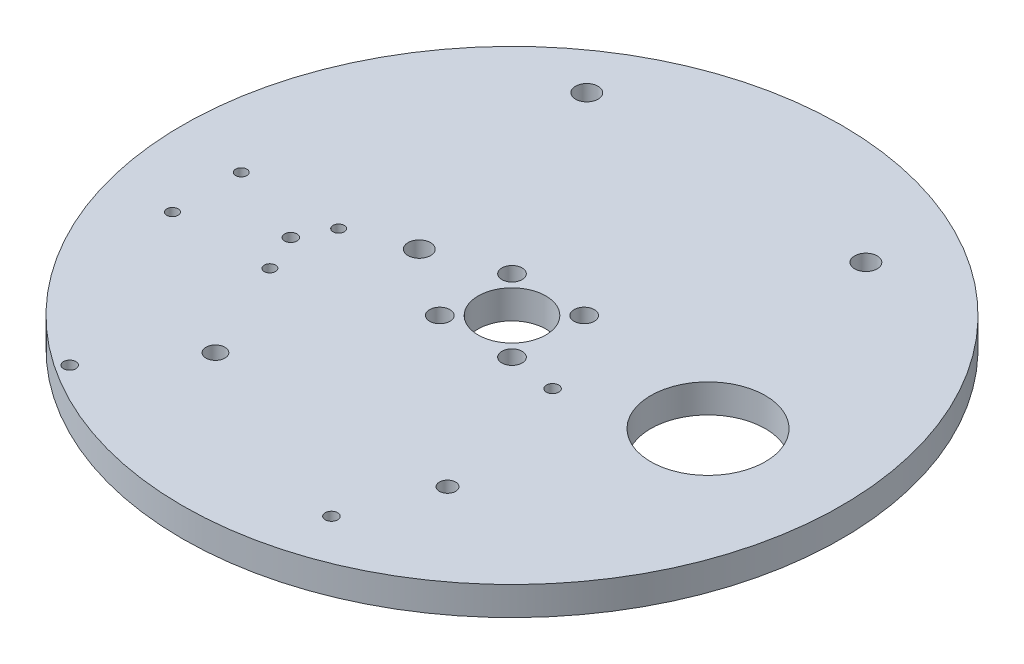
ISO-10303-21;
HEADER;
FILE_DESCRIPTION(('STEP AP214'),'2;1');
FILE_NAME('part.step','',(''),(''),'','','');
FILE_SCHEMA(('AUTOMOTIVE_DESIGN { 1 0 10303 214 1 1 1 1 }'));
ENDSEC;
DATA;
#1=APPLICATION_CONTEXT('core data for automotive mechanical design processes');
#2=APPLICATION_PROTOCOL_DEFINITION('international standard','automotive_design',2000,#1);
#3=PRODUCT_CONTEXT('',#1,'mechanical');
#4=PRODUCT('Part','Part','',(#3));
#5=PRODUCT_RELATED_PRODUCT_CATEGORY('part','',(#4));
#6=PRODUCT_DEFINITION_FORMATION('','',#4);
#7=PRODUCT_DEFINITION_CONTEXT('part definition',#1,'design');
#8=PRODUCT_DEFINITION('design','',#6,#7);
#9=PRODUCT_DEFINITION_SHAPE('','',#8);
#10=(LENGTH_UNIT() NAMED_UNIT(*) SI_UNIT(.MILLI.,.METRE.));
#11=(NAMED_UNIT(*) PLANE_ANGLE_UNIT() SI_UNIT($,.RADIAN.));
#12=(NAMED_UNIT(*) SI_UNIT($,.STERADIAN.) SOLID_ANGLE_UNIT());
#13=UNCERTAINTY_MEASURE_WITH_UNIT(LENGTH_MEASURE(1.E-05),#10,'distance_accuracy_value','');
#14=(GEOMETRIC_REPRESENTATION_CONTEXT(3) GLOBAL_UNCERTAINTY_ASSIGNED_CONTEXT((#13)) GLOBAL_UNIT_ASSIGNED_CONTEXT((#10,
#11,#12)) REPRESENTATION_CONTEXT('',''));
#15=CARTESIAN_POINT('',(0.,0.,0.));
#16=DIRECTION('',(0.,0.,1.));
#17=DIRECTION('',(1.,0.,0.));
#18=AXIS2_PLACEMENT_3D('',#15,#16,#17);
#19=CARTESIAN_POINT('',(0.,6.35,0.));
#20=DIRECTION('',(0.,1.,0.));
#21=DIRECTION('',(0.,0.,1.));
#22=AXIS2_PLACEMENT_3D('',#19,#20,#21);
#23=PLANE('',#22);
#24=CARTESIAN_POINT('',(-34.460546586566,6.35,-51.0306752149271));
#25=DIRECTION('',(0.,1.,0.));
#26=DIRECTION('',(0.,0.,1.));
#27=AXIS2_PLACEMENT_3D('',#24,#25,#26);
#28=CIRCLE('',#27,2.5);
#29=CARTESIAN_POINT('',(-34.460546586566,6.35,-48.5306752149271));
#30=VERTEX_POINT('',#29);
#31=EDGE_CURVE('E156',#30,#30,#28,.T.);
#32=ORIENTED_EDGE('',*,*,#31,.F.);
#33=EDGE_LOOP('',(#32));
#34=FACE_BOUND('',#33,.T.);
#35=CARTESIAN_POINT('',(29.0185044188483,6.35,-49.3996989882434));
#36=DIRECTION('',(0.,1.,0.));
#37=DIRECTION('',(0.,0.,1.));
#38=AXIS2_PLACEMENT_3D('',#35,#36,#37);
#39=CIRCLE('',#38,2.5);
#40=CARTESIAN_POINT('',(29.0185044188483,6.35,-46.8996989882434));
#41=VERTEX_POINT('',#40);
#42=EDGE_CURVE('E150',#41,#41,#39,.T.);
#43=ORIENTED_EDGE('',*,*,#42,.F.);
#44=EDGE_LOOP('',(#43));
#45=FACE_BOUND('',#44,.T.);
#46=CARTESIAN_POINT('',(-23.0042783177628,6.35,-2.46040120547545));
#47=DIRECTION('',(0.,1.,0.));
#48=DIRECTION('',(0.,0.,1.));
#49=AXIS2_PLACEMENT_3D('',#46,#47,#48);
#50=CIRCLE('',#49,2.5);
#51=CARTESIAN_POINT('',(-23.0042783177628,6.35,0.0395987945245486));
#52=VERTEX_POINT('',#51);
#53=EDGE_CURVE('E144',#52,#52,#50,.T.);
#54=ORIENTED_EDGE('',*,*,#53,.F.);
#55=EDGE_LOOP('',(#54));
#56=FACE_BOUND('',#55,.T.);
#57=CARTESIAN_POINT('',(18.529637443115,6.35,9.53980639289024));
#58=DIRECTION('',(0.,-1.,0.));
#59=DIRECTION('',(0.,0.,-1.));
#60=AXIS2_PLACEMENT_3D('',#57,#58,#59);
#61=CIRCLE('',#60,1.375);
#62=CARTESIAN_POINT('',(18.529637443115,6.35,8.16480639289024));
#63=VERTEX_POINT('',#62);
#64=EDGE_CURVE('E114',#63,#63,#61,.T.);
#65=ORIENTED_EDGE('',*,*,#64,.T.);
#66=EDGE_LOOP('',(#65));
#67=FACE_BOUND('',#66,.T.);
#68=CARTESIAN_POINT('',(25.7171869119312,6.35,40.));
#69=DIRECTION('',(0.,-1.,0.));
#70=DIRECTION('',(0.,0.,-1.));
#71=AXIS2_PLACEMENT_3D('',#68,#69,#70);
#72=CIRCLE('',#71,1.8);
#73=CARTESIAN_POINT('',(25.7171869119312,6.35,38.2));
#74=VERTEX_POINT('',#73);
#75=EDGE_CURVE('E121',#74,#74,#72,.T.);
#76=ORIENTED_EDGE('',*,*,#75,.T.);
#77=EDGE_LOOP('',(#76));
#78=FACE_BOUND('',#77,.T.);
#79=CARTESIAN_POINT('',(18.529637443115,6.35,58.5398063928902));
#80=DIRECTION('',(0.,-1.,0.));
#81=DIRECTION('',(0.,0.,-1.));
#82=AXIS2_PLACEMENT_3D('',#79,#80,#81);
#83=CIRCLE('',#82,1.375);
#84=CARTESIAN_POINT('',(18.529637443115,6.35,57.1648063928902));
#85=VERTEX_POINT('',#84);
#86=EDGE_CURVE('E127',#85,#85,#83,.T.);
#87=ORIENTED_EDGE('',*,*,#86,.T.);
#88=EDGE_LOOP('',(#87));
#89=FACE_BOUND('',#88,.T.);
#90=CARTESIAN_POINT('',(-39.470362556885,6.35,58.5398063928902));
#91=DIRECTION('',(0.,-1.,0.));
#92=DIRECTION('',(0.,0.,-1.));
#93=AXIS2_PLACEMENT_3D('',#90,#91,#92);
#94=CIRCLE('',#93,1.375);
#95=CARTESIAN_POINT('',(-39.470362556885,6.35,57.1648063928902));
#96=VERTEX_POINT('',#95);
#97=EDGE_CURVE('E133',#96,#96,#94,.T.);
#98=ORIENTED_EDGE('',*,*,#97,.T.);
#99=EDGE_LOOP('',(#98));
#100=FACE_BOUND('',#99,.T.);
#101=CARTESIAN_POINT('',(-57.46,6.35,2.54));
#102=DIRECTION('',(0.,-1.,0.));
#103=DIRECTION('',(0.,0.,-1.));
#104=AXIS2_PLACEMENT_3D('',#101,#102,#103);
#105=CIRCLE('',#104,1.25);
#106=CARTESIAN_POINT('',(-57.46,6.35,1.29));
#107=VERTEX_POINT('',#106);
#108=EDGE_CURVE('E90',#107,#107,#105,.T.);
#109=ORIENTED_EDGE('',*,*,#108,.T.);
#110=EDGE_LOOP('',(#109));
#111=FACE_BOUND('',#110,.T.);
#112=CARTESIAN_POINT('',(-35.87,6.35,2.54));
#113=DIRECTION('',(0.,-1.,0.));
#114=DIRECTION('',(0.,0.,-1.));
#115=AXIS2_PLACEMENT_3D('',#112,#113,#114);
#116=CIRCLE('',#115,1.25);
#117=CARTESIAN_POINT('',(-35.87,6.35,1.29));
#118=VERTEX_POINT('',#117);
#119=EDGE_CURVE('E97',#118,#118,#116,.T.);
#120=ORIENTED_EDGE('',*,*,#119,.T.);
#121=EDGE_LOOP('',(#120));
#122=FACE_BOUND('',#121,.T.);
#123=CARTESIAN_POINT('',(-39.470362556885,6.35,9.53980639289024));
#124=DIRECTION('',(0.,-1.,0.));
#125=DIRECTION('',(0.,0.,-1.));
#126=AXIS2_PLACEMENT_3D('',#123,#124,#125);
#127=CIRCLE('',#126,1.375);
#128=CARTESIAN_POINT('',(-39.470362556885,6.35,8.16480639289024));
#129=VERTEX_POINT('',#128);
#130=EDGE_CURVE('E103',#129,#129,#127,.T.);
#131=ORIENTED_EDGE('',*,*,#130,.T.);
#132=EDGE_LOOP('',(#131));
#133=FACE_BOUND('',#132,.T.);
#134=CARTESIAN_POINT('',(-57.46,6.35,17.78));
#135=DIRECTION('',(0.,-1.,0.));
#136=DIRECTION('',(0.,0.,-1.));
#137=AXIS2_PLACEMENT_3D('',#134,#135,#136);
#138=CIRCLE('',#137,1.25);
#139=CARTESIAN_POINT('',(-57.46,6.35,16.53));
#140=VERTEX_POINT('',#139);
#141=EDGE_CURVE('E109',#140,#140,#138,.T.);
#142=ORIENTED_EDGE('',*,*,#141,.T.);
#143=EDGE_LOOP('',(#142));
#144=FACE_BOUND('',#143,.T.);
#145=CARTESIAN_POINT('',(-35.87,6.35,17.78));
#146=DIRECTION('',(0.,-1.,0.));
#147=DIRECTION('',(0.,0.,-1.));
#148=AXIS2_PLACEMENT_3D('',#145,#146,#147);
#149=CIRCLE('',#148,1.25);
#150=CARTESIAN_POINT('',(-35.87,6.35,16.53));
#151=VERTEX_POINT('',#150);
#152=EDGE_CURVE('E138',#151,#151,#149,.T.);
#153=ORIENTED_EDGE('',*,*,#152,.T.);
#154=EDGE_LOOP('',(#153));
#155=FACE_BOUND('',#154,.T.);
#156=CARTESIAN_POINT('',(-25.7171869119312,6.35,40.));
#157=DIRECTION('',(0.,-1.,0.));
#158=DIRECTION('',(0.,0.,-1.));
#159=AXIS2_PLACEMENT_3D('',#156,#157,#158);
#160=CIRCLE('',#159,2.1);
#161=CARTESIAN_POINT('',(-25.7171869119312,6.35,37.9));
#162=VERTEX_POINT('',#161);
#163=EDGE_CURVE('E81',#162,#162,#160,.T.);
#164=ORIENTED_EDGE('',*,*,#163,.T.);
#165=EDGE_LOOP('',(#164));
#166=FACE_BOUND('',#165,.T.);
#167=CARTESIAN_POINT('',(43.4341818398759,6.35,0.));
#168=DIRECTION('',(0.,-1.,0.));
#169=DIRECTION('',(0.,0.,-1.));
#170=AXIS2_PLACEMENT_3D('',#167,#168,#169);
#171=CIRCLE('',#170,12.7);
#172=CARTESIAN_POINT('',(43.4341818398759,6.35,-12.7));
#173=VERTEX_POINT('',#172);
#174=EDGE_CURVE('E64',#173,#173,#171,.T.);
#175=ORIENTED_EDGE('',*,*,#174,.T.);
#176=EDGE_LOOP('',(#175));
#177=FACE_BOUND('',#176,.T.);
#178=CARTESIAN_POINT('',(8.,6.35,-8.));
#179=DIRECTION('',(0.,1.,0.));
#180=DIRECTION('',(0.,0.,1.));
#181=AXIS2_PLACEMENT_3D('',#178,#179,#180);
#182=CIRCLE('',#181,2.25);
#183=CARTESIAN_POINT('',(8.,6.35,-5.75));
#184=VERTEX_POINT('',#183);
#185=EDGE_CURVE('E57',#184,#184,#182,.F.);
#186=ORIENTED_EDGE('',*,*,#185,.T.);
#187=EDGE_LOOP('',(#186));
#188=FACE_BOUND('',#187,.T.);
#189=CARTESIAN_POINT('',(-8.,6.35,-8.));
#190=DIRECTION('',(0.,1.,0.));
#191=DIRECTION('',(0.,0.,1.));
#192=AXIS2_PLACEMENT_3D('',#189,#190,#191);
#193=CIRCLE('',#192,2.25);
#194=CARTESIAN_POINT('',(-8.,6.35,-5.75));
#195=VERTEX_POINT('',#194);
#196=EDGE_CURVE('E54',#195,#195,#193,.T.);
#197=ORIENTED_EDGE('',*,*,#196,.F.);
#198=EDGE_LOOP('',(#197));
#199=FACE_BOUND('',#198,.T.);
#200=CARTESIAN_POINT('',(0.,6.35,0.));
#201=DIRECTION('',(0.,1.,0.));
#202=DIRECTION('',(0.,0.,1.));
#203=AXIS2_PLACEMENT_3D('',#200,#201,#202);
#204=CIRCLE('',#203,7.5);
#205=CARTESIAN_POINT('',(0.,6.35,7.5));
#206=VERTEX_POINT('',#205);
#207=EDGE_CURVE('E48',#206,#206,#204,.T.);
#208=ORIENTED_EDGE('',*,*,#207,.F.);
#209=EDGE_LOOP('',(#208));
#210=FACE_BOUND('',#209,.T.);
#211=CARTESIAN_POINT('',(0.,6.35,0.));
#212=DIRECTION('',(0.,1.,0.));
#213=DIRECTION('',(0.,0.,1.));
#214=AXIS2_PLACEMENT_3D('',#211,#212,#213);
#215=CIRCLE('',#214,73.025);
#216=CARTESIAN_POINT('',(0.,6.35,73.025));
#217=VERTEX_POINT('',#216);
#218=EDGE_CURVE('E10',#217,#217,#215,.T.);
#219=ORIENTED_EDGE('',*,*,#218,.T.);
#220=EDGE_LOOP('',(#219));
#221=FACE_BOUND('',#220,.T.);
#222=CARTESIAN_POINT('',(8.,6.35,8.));
#223=DIRECTION('',(0.,1.,0.));
#224=DIRECTION('',(0.,0.,1.));
#225=AXIS2_PLACEMENT_3D('',#222,#223,#224);
#226=CIRCLE('',#225,2.25);
#227=CARTESIAN_POINT('',(8.,6.35,10.25));
#228=VERTEX_POINT('',#227);
#229=EDGE_CURVE('E70',#228,#228,#226,.T.);
#230=ORIENTED_EDGE('',*,*,#229,.F.);
#231=EDGE_LOOP('',(#230));
#232=FACE_BOUND('',#231,.T.);
#233=CARTESIAN_POINT('',(-8.,6.35,8.00000000000001));
#234=DIRECTION('',(0.,1.,0.));
#235=DIRECTION('',(0.,0.,1.));
#236=AXIS2_PLACEMENT_3D('',#233,#234,#235);
#237=CIRCLE('',#236,2.25);
#238=CARTESIAN_POINT('',(-8.,6.35,10.25));
#239=VERTEX_POINT('',#238);
#240=EDGE_CURVE('E63',#239,#239,#237,.F.);
#241=ORIENTED_EDGE('',*,*,#240,.T.);
#242=EDGE_LOOP('',(#241));
#243=FACE_BOUND('',#242,.T.);
#244=ADVANCED_FACE('F35',(#34,#45,#56,#67,#78,#89,#100,#111,#122,#133,#144,#155,#166,#177,#188,
#199,#210,#221,#232,#243),#23,.T.);
#245=CARTESIAN_POINT('',(0.,0.,0.));
#246=DIRECTION('',(0.,1.,0.));
#247=DIRECTION('',(0.,0.,1.));
#248=AXIS2_PLACEMENT_3D('',#245,#246,#247);
#249=PLANE('',#248);
#250=CARTESIAN_POINT('',(-34.460546586566,0.,-51.0306752149271));
#251=DIRECTION('',(0.,1.,0.));
#252=DIRECTION('',(0.,0.,1.));
#253=AXIS2_PLACEMENT_3D('',#250,#251,#252);
#254=CIRCLE('',#253,2.5);
#255=CARTESIAN_POINT('',(-34.460546586566,0.,-48.5306752149271));
#256=VERTEX_POINT('',#255);
#257=EDGE_CURVE('E141',#256,#256,#254,.T.);
#258=ORIENTED_EDGE('',*,*,#257,.T.);
#259=EDGE_LOOP('',(#258));
#260=FACE_BOUND('',#259,.T.);
#261=CARTESIAN_POINT('',(29.0185044188483,0.,-49.3996989882434));
#262=DIRECTION('',(0.,1.,0.));
#263=DIRECTION('',(0.,0.,1.));
#264=AXIS2_PLACEMENT_3D('',#261,#262,#263);
#265=CIRCLE('',#264,2.5);
#266=CARTESIAN_POINT('',(29.0185044188483,0.,-46.8996989882434));
#267=VERTEX_POINT('',#266);
#268=EDGE_CURVE('E153',#267,#267,#265,.T.);
#269=ORIENTED_EDGE('',*,*,#268,.T.);
#270=EDGE_LOOP('',(#269));
#271=FACE_BOUND('',#270,.T.);
#272=CARTESIAN_POINT('',(-23.0042783177628,0.,-2.46040120547545));
#273=DIRECTION('',(0.,1.,0.));
#274=DIRECTION('',(0.,0.,1.));
#275=AXIS2_PLACEMENT_3D('',#272,#273,#274);
#276=CIRCLE('',#275,2.5);
#277=CARTESIAN_POINT('',(-23.0042783177628,0.,0.0395987945245486));
#278=VERTEX_POINT('',#277);
#279=EDGE_CURVE('E147',#278,#278,#276,.T.);
#280=ORIENTED_EDGE('',*,*,#279,.T.);
#281=EDGE_LOOP('',(#280));
#282=FACE_BOUND('',#281,.T.);
#283=CARTESIAN_POINT('',(18.529637443115,0.,9.53980639289024));
#284=DIRECTION('',(0.,-1.,0.));
#285=DIRECTION('',(0.,0.,-1.));
#286=AXIS2_PLACEMENT_3D('',#283,#284,#285);
#287=CIRCLE('',#286,1.375);
#288=CARTESIAN_POINT('',(18.529637443115,0.,8.16480639289024));
#289=VERTEX_POINT('',#288);
#290=EDGE_CURVE('E117',#289,#289,#287,.T.);
#291=ORIENTED_EDGE('',*,*,#290,.F.);
#292=EDGE_LOOP('',(#291));
#293=FACE_BOUND('',#292,.T.);
#294=CARTESIAN_POINT('',(25.7171869119312,0.,40.));
#295=DIRECTION('',(0.,-1.,0.));
#296=DIRECTION('',(0.,0.,-1.));
#297=AXIS2_PLACEMENT_3D('',#294,#295,#296);
#298=CIRCLE('',#297,1.8);
#299=CARTESIAN_POINT('',(25.7171869119312,0.,38.2));
#300=VERTEX_POINT('',#299);
#301=EDGE_CURVE('E124',#300,#300,#298,.T.);
#302=ORIENTED_EDGE('',*,*,#301,.F.);
#303=EDGE_LOOP('',(#302));
#304=FACE_BOUND('',#303,.T.);
#305=CARTESIAN_POINT('',(18.529637443115,0.,58.5398063928902));
#306=DIRECTION('',(0.,-1.,0.));
#307=DIRECTION('',(0.,0.,-1.));
#308=AXIS2_PLACEMENT_3D('',#305,#306,#307);
#309=CIRCLE('',#308,1.375);
#310=CARTESIAN_POINT('',(18.529637443115,0.,57.1648063928902));
#311=VERTEX_POINT('',#310);
#312=EDGE_CURVE('E130',#311,#311,#309,.T.);
#313=ORIENTED_EDGE('',*,*,#312,.F.);
#314=EDGE_LOOP('',(#313));
#315=FACE_BOUND('',#314,.T.);
#316=CARTESIAN_POINT('',(-39.470362556885,0.,58.5398063928902));
#317=DIRECTION('',(0.,-1.,0.));
#318=DIRECTION('',(0.,0.,-1.));
#319=AXIS2_PLACEMENT_3D('',#316,#317,#318);
#320=CIRCLE('',#319,1.375);
#321=CARTESIAN_POINT('',(-39.470362556885,0.,57.1648063928902));
#322=VERTEX_POINT('',#321);
#323=EDGE_CURVE('E94',#322,#322,#320,.T.);
#324=ORIENTED_EDGE('',*,*,#323,.F.);
#325=EDGE_LOOP('',(#324));
#326=FACE_BOUND('',#325,.T.);
#327=CARTESIAN_POINT('',(-57.46,0.,2.54));
#328=DIRECTION('',(0.,-1.,0.));
#329=DIRECTION('',(0.,0.,-1.));
#330=AXIS2_PLACEMENT_3D('',#327,#328,#329);
#331=CIRCLE('',#330,1.25);
#332=CARTESIAN_POINT('',(-57.46,0.,1.29));
#333=VERTEX_POINT('',#332);
#334=EDGE_CURVE('E93',#333,#333,#331,.T.);
#335=ORIENTED_EDGE('',*,*,#334,.F.);
#336=EDGE_LOOP('',(#335));
#337=FACE_BOUND('',#336,.T.);
#338=CARTESIAN_POINT('',(-35.87,0.,2.54));
#339=DIRECTION('',(0.,-1.,0.));
#340=DIRECTION('',(0.,0.,-1.));
#341=AXIS2_PLACEMENT_3D('',#338,#339,#340);
#342=CIRCLE('',#341,1.25);
#343=CARTESIAN_POINT('',(-35.87,0.,1.29));
#344=VERTEX_POINT('',#343);
#345=EDGE_CURVE('E100',#344,#344,#342,.T.);
#346=ORIENTED_EDGE('',*,*,#345,.F.);
#347=EDGE_LOOP('',(#346));
#348=FACE_BOUND('',#347,.T.);
#349=CARTESIAN_POINT('',(-39.470362556885,0.,9.53980639289024));
#350=DIRECTION('',(0.,-1.,0.));
#351=DIRECTION('',(0.,0.,-1.));
#352=AXIS2_PLACEMENT_3D('',#349,#350,#351);
#353=CIRCLE('',#352,1.375);
#354=CARTESIAN_POINT('',(-39.470362556885,0.,8.16480639289024));
#355=VERTEX_POINT('',#354);
#356=EDGE_CURVE('E106',#355,#355,#353,.T.);
#357=ORIENTED_EDGE('',*,*,#356,.F.);
#358=EDGE_LOOP('',(#357));
#359=FACE_BOUND('',#358,.T.);
#360=CARTESIAN_POINT('',(-57.46,0.,17.78));
#361=DIRECTION('',(0.,-1.,0.));
#362=DIRECTION('',(0.,0.,-1.));
#363=AXIS2_PLACEMENT_3D('',#360,#361,#362);
#364=CIRCLE('',#363,1.25);
#365=CARTESIAN_POINT('',(-57.46,0.,16.53));
#366=VERTEX_POINT('',#365);
#367=EDGE_CURVE('E87',#366,#366,#364,.T.);
#368=ORIENTED_EDGE('',*,*,#367,.F.);
#369=EDGE_LOOP('',(#368));
#370=FACE_BOUND('',#369,.T.);
#371=CARTESIAN_POINT('',(-35.87,0.,17.78));
#372=DIRECTION('',(0.,-1.,0.));
#373=DIRECTION('',(0.,0.,-1.));
#374=AXIS2_PLACEMENT_3D('',#371,#372,#373);
#375=CIRCLE('',#374,1.25);
#376=CARTESIAN_POINT('',(-35.87,0.,16.53));
#377=VERTEX_POINT('',#376);
#378=EDGE_CURVE('E118',#377,#377,#375,.T.);
#379=ORIENTED_EDGE('',*,*,#378,.F.);
#380=EDGE_LOOP('',(#379));
#381=FACE_BOUND('',#380,.T.);
#382=CARTESIAN_POINT('',(-25.7171869119312,0.,40.));
#383=DIRECTION('',(0.,-1.,0.));
#384=DIRECTION('',(0.,0.,-1.));
#385=AXIS2_PLACEMENT_3D('',#382,#383,#384);
#386=CIRCLE('',#385,2.1);
#387=CARTESIAN_POINT('',(-25.7171869119312,0.,37.9));
#388=VERTEX_POINT('',#387);
#389=EDGE_CURVE('E84',#388,#388,#386,.T.);
#390=ORIENTED_EDGE('',*,*,#389,.F.);
#391=EDGE_LOOP('',(#390));
#392=FACE_BOUND('',#391,.T.);
#393=CARTESIAN_POINT('',(43.4341818398759,0.,0.));
#394=DIRECTION('',(0.,-1.,0.));
#395=DIRECTION('',(0.,0.,-1.));
#396=AXIS2_PLACEMENT_3D('',#393,#394,#395);
#397=CIRCLE('',#396,12.7);
#398=CARTESIAN_POINT('',(43.4341818398759,0.,-12.7));
#399=VERTEX_POINT('',#398);
#400=EDGE_CURVE('E78',#399,#399,#397,.T.);
#401=ORIENTED_EDGE('',*,*,#400,.F.);
#402=EDGE_LOOP('',(#401));
#403=FACE_BOUND('',#402,.T.);
#404=CARTESIAN_POINT('',(8.,0.,8.));
#405=DIRECTION('',(0.,1.,0.));
#406=DIRECTION('',(0.,0.,1.));
#407=AXIS2_PLACEMENT_3D('',#404,#405,#406);
#408=CIRCLE('',#407,2.25);
#409=CARTESIAN_POINT('',(8.,0.,10.25));
#410=VERTEX_POINT('',#409);
#411=EDGE_CURVE('E67',#410,#410,#408,.T.);
#412=ORIENTED_EDGE('',*,*,#411,.T.);
#413=EDGE_LOOP('',(#412));
#414=FACE_BOUND('',#413,.T.);
#415=CARTESIAN_POINT('',(-8.,0.,-8.));
#416=DIRECTION('',(0.,1.,0.));
#417=DIRECTION('',(0.,0.,1.));
#418=AXIS2_PLACEMENT_3D('',#415,#416,#417);
#419=CIRCLE('',#418,2.25);
#420=CARTESIAN_POINT('',(-8.,0.,-5.75));
#421=VERTEX_POINT('',#420);
#422=EDGE_CURVE('E51',#421,#421,#419,.T.);
#423=ORIENTED_EDGE('',*,*,#422,.T.);
#424=EDGE_LOOP('',(#423));
#425=FACE_BOUND('',#424,.T.);
#426=CARTESIAN_POINT('',(0.,0.,0.));
#427=DIRECTION('',(0.,1.,0.));
#428=DIRECTION('',(0.,0.,1.));
#429=AXIS2_PLACEMENT_3D('',#426,#427,#428);
#430=CIRCLE('',#429,7.5);
#431=CARTESIAN_POINT('',(0.,0.,7.5));
#432=VERTEX_POINT('',#431);
#433=EDGE_CURVE('E46',#432,#432,#430,.T.);
#434=ORIENTED_EDGE('',*,*,#433,.T.);
#435=EDGE_LOOP('',(#434));
#436=FACE_BOUND('',#435,.T.);
#437=CARTESIAN_POINT('',(0.,0.,0.));
#438=DIRECTION('',(0.,1.,0.));
#439=DIRECTION('',(0.,0.,1.));
#440=AXIS2_PLACEMENT_3D('',#437,#438,#439);
#441=CIRCLE('',#440,73.025);
#442=CARTESIAN_POINT('',(0.,0.,73.025));
#443=VERTEX_POINT('',#442);
#444=EDGE_CURVE('E39',#443,#443,#441,.T.);
#445=ORIENTED_EDGE('',*,*,#444,.F.);
#446=EDGE_LOOP('',(#445));
#447=FACE_BOUND('',#446,.T.);
#448=CARTESIAN_POINT('',(8.,0.,-8.));
#449=DIRECTION('',(0.,1.,0.));
#450=DIRECTION('',(0.,0.,1.));
#451=AXIS2_PLACEMENT_3D('',#448,#449,#450);
#452=CIRCLE('',#451,2.25);
#453=CARTESIAN_POINT('',(8.,0.,-5.75));
#454=VERTEX_POINT('',#453);
#455=EDGE_CURVE('E73',#454,#454,#452,.F.);
#456=ORIENTED_EDGE('',*,*,#455,.F.);
#457=EDGE_LOOP('',(#456));
#458=FACE_BOUND('',#457,.T.);
#459=CARTESIAN_POINT('',(-8.,0.,8.00000000000001));
#460=DIRECTION('',(0.,1.,0.));
#461=DIRECTION('',(0.,0.,1.));
#462=AXIS2_PLACEMENT_3D('',#459,#460,#461);
#463=CIRCLE('',#462,2.25);
#464=CARTESIAN_POINT('',(-8.,0.,10.25));
#465=VERTEX_POINT('',#464);
#466=EDGE_CURVE('E60',#465,#465,#463,.F.);
#467=ORIENTED_EDGE('',*,*,#466,.F.);
#468=EDGE_LOOP('',(#467));
#469=FACE_BOUND('',#468,.T.);
#470=ADVANCED_FACE('F162',(#260,#271,#282,#293,#304,#315,#326,#337,#348,#359,#370,#381,#392,
#403,#414,#425,#436,#447,#458,#469),#249,.F.);
#471=CARTESIAN_POINT('',(0.,6.35,0.));
#472=DIRECTION('',(0.,-1.,0.));
#473=DIRECTION('',(0.,0.,-1.));
#474=AXIS2_PLACEMENT_3D('',#471,#472,#473);
#475=CYLINDRICAL_SURFACE('',#474,73.025);
#476=ORIENTED_EDGE('',*,*,#218,.F.);
#477=EDGE_LOOP('',(#476));
#478=FACE_BOUND('',#477,.T.);
#479=ORIENTED_EDGE('',*,*,#444,.T.);
#480=EDGE_LOOP('',(#479));
#481=FACE_BOUND('',#480,.T.);
#482=ADVANCED_FACE('F37',(#478,#481),#475,.T.);
#483=CARTESIAN_POINT('',(0.,0.,0.));
#484=DIRECTION('',(0.,1.,0.));
#485=DIRECTION('',(0.,0.,1.));
#486=AXIS2_PLACEMENT_3D('',#483,#484,#485);
#487=CYLINDRICAL_SURFACE('',#486,7.5);
#488=ORIENTED_EDGE('',*,*,#433,.F.);
#489=EDGE_LOOP('',(#488));
#490=FACE_BOUND('',#489,.T.);
#491=ORIENTED_EDGE('',*,*,#207,.T.);
#492=EDGE_LOOP('',(#491));
#493=FACE_BOUND('',#492,.T.);
#494=ADVANCED_FACE('F232',(#490,#493),#487,.F.);
#495=CARTESIAN_POINT('',(-8.,0.,-8.));
#496=DIRECTION('',(0.,1.,0.));
#497=DIRECTION('',(0.,0.,1.));
#498=AXIS2_PLACEMENT_3D('',#495,#496,#497);
#499=CYLINDRICAL_SURFACE('',#498,2.25);
#500=ORIENTED_EDGE('',*,*,#422,.F.);
#501=EDGE_LOOP('',(#500));
#502=FACE_BOUND('',#501,.T.);
#503=ORIENTED_EDGE('',*,*,#196,.T.);
#504=EDGE_LOOP('',(#503));
#505=FACE_BOUND('',#504,.T.);
#506=ADVANCED_FACE('F229',(#502,#505),#499,.F.);
#507=CARTESIAN_POINT('',(8.,0.,-8.));
#508=DIRECTION('',(0.,1.,0.));
#509=DIRECTION('',(0.,0.,1.));
#510=AXIS2_PLACEMENT_3D('',#507,#508,#509);
#511=CYLINDRICAL_SURFACE('',#510,2.25);
#512=ORIENTED_EDGE('',*,*,#455,.T.);
#513=EDGE_LOOP('',(#512));
#514=FACE_BOUND('',#513,.T.);
#515=ORIENTED_EDGE('',*,*,#185,.F.);
#516=EDGE_LOOP('',(#515));
#517=FACE_BOUND('',#516,.T.);
#518=ADVANCED_FACE('F224',(#514,#517),#511,.F.);
#519=CARTESIAN_POINT('',(8.,0.,8.));
#520=DIRECTION('',(0.,1.,0.));
#521=DIRECTION('',(0.,0.,1.));
#522=AXIS2_PLACEMENT_3D('',#519,#520,#521);
#523=CYLINDRICAL_SURFACE('',#522,2.25);
#524=ORIENTED_EDGE('',*,*,#411,.F.);
#525=EDGE_LOOP('',(#524));
#526=FACE_BOUND('',#525,.T.);
#527=ORIENTED_EDGE('',*,*,#229,.T.);
#528=EDGE_LOOP('',(#527));
#529=FACE_BOUND('',#528,.T.);
#530=ADVANCED_FACE('F214',(#526,#529),#523,.F.);
#531=CARTESIAN_POINT('',(-8.,0.,8.00000000000001));
#532=DIRECTION('',(0.,1.,0.));
#533=DIRECTION('',(0.,0.,1.));
#534=AXIS2_PLACEMENT_3D('',#531,#532,#533);
#535=CYLINDRICAL_SURFACE('',#534,2.25);
#536=ORIENTED_EDGE('',*,*,#466,.T.);
#537=EDGE_LOOP('',(#536));
#538=FACE_BOUND('',#537,.T.);
#539=ORIENTED_EDGE('',*,*,#240,.F.);
#540=EDGE_LOOP('',(#539));
#541=FACE_BOUND('',#540,.T.);
#542=ADVANCED_FACE('F211',(#538,#541),#535,.F.);
#543=CARTESIAN_POINT('',(43.4341818398759,6.35,0.));
#544=DIRECTION('',(0.,-1.,0.));
#545=DIRECTION('',(0.,0.,-1.));
#546=AXIS2_PLACEMENT_3D('',#543,#544,#545);
#547=CYLINDRICAL_SURFACE('',#546,12.7);
#548=ORIENTED_EDGE('',*,*,#174,.F.);
#549=EDGE_LOOP('',(#548));
#550=FACE_BOUND('',#549,.T.);
#551=ORIENTED_EDGE('',*,*,#400,.T.);
#552=EDGE_LOOP('',(#551));
#553=FACE_BOUND('',#552,.T.);
#554=ADVANCED_FACE('F213',(#550,#553),#547,.F.);
#555=CARTESIAN_POINT('',(-25.7171869119312,6.35,40.));
#556=DIRECTION('',(0.,-1.,0.));
#557=DIRECTION('',(0.,0.,-1.));
#558=AXIS2_PLACEMENT_3D('',#555,#556,#557);
#559=CYLINDRICAL_SURFACE('',#558,2.1);
#560=ORIENTED_EDGE('',*,*,#163,.F.);
#561=EDGE_LOOP('',(#560));
#562=FACE_BOUND('',#561,.T.);
#563=ORIENTED_EDGE('',*,*,#389,.T.);
#564=EDGE_LOOP('',(#563));
#565=FACE_BOUND('',#564,.T.);
#566=ADVANCED_FACE('F221',(#562,#565),#559,.F.);
#567=CARTESIAN_POINT('',(-35.87,6.35,17.78));
#568=DIRECTION('',(0.,-1.,0.));
#569=DIRECTION('',(0.,0.,-1.));
#570=AXIS2_PLACEMENT_3D('',#567,#568,#569);
#571=CYLINDRICAL_SURFACE('',#570,1.25);
#572=ORIENTED_EDGE('',*,*,#152,.F.);
#573=EDGE_LOOP('',(#572));
#574=FACE_BOUND('',#573,.T.);
#575=ORIENTED_EDGE('',*,*,#378,.T.);
#576=EDGE_LOOP('',(#575));
#577=FACE_BOUND('',#576,.T.);
#578=ADVANCED_FACE('F258',(#574,#577),#571,.F.);
#579=CARTESIAN_POINT('',(-57.46,6.35,17.78));
#580=DIRECTION('',(0.,-1.,0.));
#581=DIRECTION('',(0.,0.,-1.));
#582=AXIS2_PLACEMENT_3D('',#579,#580,#581);
#583=CYLINDRICAL_SURFACE('',#582,1.25);
#584=ORIENTED_EDGE('',*,*,#141,.F.);
#585=EDGE_LOOP('',(#584));
#586=FACE_BOUND('',#585,.T.);
#587=ORIENTED_EDGE('',*,*,#367,.T.);
#588=EDGE_LOOP('',(#587));
#589=FACE_BOUND('',#588,.T.);
#590=ADVANCED_FACE('F272',(#586,#589),#583,.F.);
#591=CARTESIAN_POINT('',(-39.470362556885,6.35,9.53980639289024));
#592=DIRECTION('',(0.,-1.,0.));
#593=DIRECTION('',(0.,0.,-1.));
#594=AXIS2_PLACEMENT_3D('',#591,#592,#593);
#595=CYLINDRICAL_SURFACE('',#594,1.375);
#596=ORIENTED_EDGE('',*,*,#130,.F.);
#597=EDGE_LOOP('',(#596));
#598=FACE_BOUND('',#597,.T.);
#599=ORIENTED_EDGE('',*,*,#356,.T.);
#600=EDGE_LOOP('',(#599));
#601=FACE_BOUND('',#600,.T.);
#602=ADVANCED_FACE('F268',(#598,#601),#595,.F.);
#603=CARTESIAN_POINT('',(-35.87,6.35,2.54));
#604=DIRECTION('',(0.,-1.,0.));
#605=DIRECTION('',(0.,0.,-1.));
#606=AXIS2_PLACEMENT_3D('',#603,#604,#605);
#607=CYLINDRICAL_SURFACE('',#606,1.25);
#608=ORIENTED_EDGE('',*,*,#119,.F.);
#609=EDGE_LOOP('',(#608));
#610=FACE_BOUND('',#609,.T.);
#611=ORIENTED_EDGE('',*,*,#345,.T.);
#612=EDGE_LOOP('',(#611));
#613=FACE_BOUND('',#612,.T.);
#614=ADVANCED_FACE('F264',(#610,#613),#607,.F.);
#615=CARTESIAN_POINT('',(-57.46,6.35,2.54));
#616=DIRECTION('',(0.,-1.,0.));
#617=DIRECTION('',(0.,0.,-1.));
#618=AXIS2_PLACEMENT_3D('',#615,#616,#617);
#619=CYLINDRICAL_SURFACE('',#618,1.25);
#620=ORIENTED_EDGE('',*,*,#108,.F.);
#621=EDGE_LOOP('',(#620));
#622=FACE_BOUND('',#621,.T.);
#623=ORIENTED_EDGE('',*,*,#334,.T.);
#624=EDGE_LOOP('',(#623));
#625=FACE_BOUND('',#624,.T.);
#626=ADVANCED_FACE('F260',(#622,#625),#619,.F.);
#627=CARTESIAN_POINT('',(-39.470362556885,6.35,58.5398063928902));
#628=DIRECTION('',(0.,-1.,0.));
#629=DIRECTION('',(0.,0.,-1.));
#630=AXIS2_PLACEMENT_3D('',#627,#628,#629);
#631=CYLINDRICAL_SURFACE('',#630,1.375);
#632=ORIENTED_EDGE('',*,*,#97,.F.);
#633=EDGE_LOOP('',(#632));
#634=FACE_BOUND('',#633,.T.);
#635=ORIENTED_EDGE('',*,*,#323,.T.);
#636=EDGE_LOOP('',(#635));
#637=FACE_BOUND('',#636,.T.);
#638=ADVANCED_FACE('F263',(#634,#637),#631,.F.);
#639=CARTESIAN_POINT('',(18.529637443115,6.35,58.5398063928902));
#640=DIRECTION('',(0.,-1.,0.));
#641=DIRECTION('',(0.,0.,-1.));
#642=AXIS2_PLACEMENT_3D('',#639,#640,#641);
#643=CYLINDRICAL_SURFACE('',#642,1.375);
#644=ORIENTED_EDGE('',*,*,#86,.F.);
#645=EDGE_LOOP('',(#644));
#646=FACE_BOUND('',#645,.T.);
#647=ORIENTED_EDGE('',*,*,#312,.T.);
#648=EDGE_LOOP('',(#647));
#649=FACE_BOUND('',#648,.T.);
#650=ADVANCED_FACE('F285',(#646,#649),#643,.F.);
#651=CARTESIAN_POINT('',(25.7171869119312,6.35,40.));
#652=DIRECTION('',(0.,-1.,0.));
#653=DIRECTION('',(0.,0.,-1.));
#654=AXIS2_PLACEMENT_3D('',#651,#652,#653);
#655=CYLINDRICAL_SURFACE('',#654,1.8);
#656=ORIENTED_EDGE('',*,*,#75,.F.);
#657=EDGE_LOOP('',(#656));
#658=FACE_BOUND('',#657,.T.);
#659=ORIENTED_EDGE('',*,*,#301,.T.);
#660=EDGE_LOOP('',(#659));
#661=FACE_BOUND('',#660,.T.);
#662=ADVANCED_FACE('F281',(#658,#661),#655,.F.);
#663=CARTESIAN_POINT('',(18.529637443115,6.35,9.53980639289024));
#664=DIRECTION('',(0.,-1.,0.));
#665=DIRECTION('',(0.,0.,-1.));
#666=AXIS2_PLACEMENT_3D('',#663,#664,#665);
#667=CYLINDRICAL_SURFACE('',#666,1.375);
#668=ORIENTED_EDGE('',*,*,#64,.F.);
#669=EDGE_LOOP('',(#668));
#670=FACE_BOUND('',#669,.T.);
#671=ORIENTED_EDGE('',*,*,#290,.T.);
#672=EDGE_LOOP('',(#671));
#673=FACE_BOUND('',#672,.T.);
#674=ADVANCED_FACE('F277',(#670,#673),#667,.F.);
#675=CARTESIAN_POINT('',(-23.0042783177628,0.,-2.46040120547545));
#676=DIRECTION('',(0.,1.,0.));
#677=DIRECTION('',(0.,0.,1.));
#678=AXIS2_PLACEMENT_3D('',#675,#676,#677);
#679=CYLINDRICAL_SURFACE('',#678,2.5);
#680=ORIENTED_EDGE('',*,*,#279,.F.);
#681=EDGE_LOOP('',(#680));
#682=FACE_BOUND('',#681,.T.);
#683=ORIENTED_EDGE('',*,*,#53,.T.);
#684=EDGE_LOOP('',(#683));
#685=FACE_BOUND('',#684,.T.);
#686=ADVANCED_FACE('F280',(#682,#685),#679,.F.);
#687=CARTESIAN_POINT('',(29.0185044188483,0.,-49.3996989882434));
#688=DIRECTION('',(0.,1.,0.));
#689=DIRECTION('',(0.,0.,1.));
#690=AXIS2_PLACEMENT_3D('',#687,#688,#689);
#691=CYLINDRICAL_SURFACE('',#690,2.5);
#692=ORIENTED_EDGE('',*,*,#268,.F.);
#693=EDGE_LOOP('',(#692));
#694=FACE_BOUND('',#693,.T.);
#695=ORIENTED_EDGE('',*,*,#42,.T.);
#696=EDGE_LOOP('',(#695));
#697=FACE_BOUND('',#696,.T.);
#698=ADVANCED_FACE('F168',(#694,#697),#691,.F.);
#699=CARTESIAN_POINT('',(-34.460546586566,0.,-51.0306752149271));
#700=DIRECTION('',(0.,1.,0.));
#701=DIRECTION('',(0.,0.,1.));
#702=AXIS2_PLACEMENT_3D('',#699,#700,#701);
#703=CYLINDRICAL_SURFACE('',#702,2.5);
#704=ORIENTED_EDGE('',*,*,#257,.F.);
#705=EDGE_LOOP('',(#704));
#706=FACE_BOUND('',#705,.T.);
#707=ORIENTED_EDGE('',*,*,#31,.T.);
#708=EDGE_LOOP('',(#707));
#709=FACE_BOUND('',#708,.T.);
#710=ADVANCED_FACE('F165',(#706,#709),#703,.F.);
#711=CLOSED_SHELL('',(#244,#470,#482,#494,#506,#518,#530,#542,#554,#566,#578,#590,#602,#614,
#626,#638,#650,#662,#674,#686,#698,#710));
#712=MANIFOLD_SOLID_BREP('B2',#711);
#713=ADVANCED_BREP_SHAPE_REPRESENTATION('',(#18,#712),#14);
#714=SHAPE_DEFINITION_REPRESENTATION(#9,#713);
ENDSEC;
END-ISO-10303-21;
